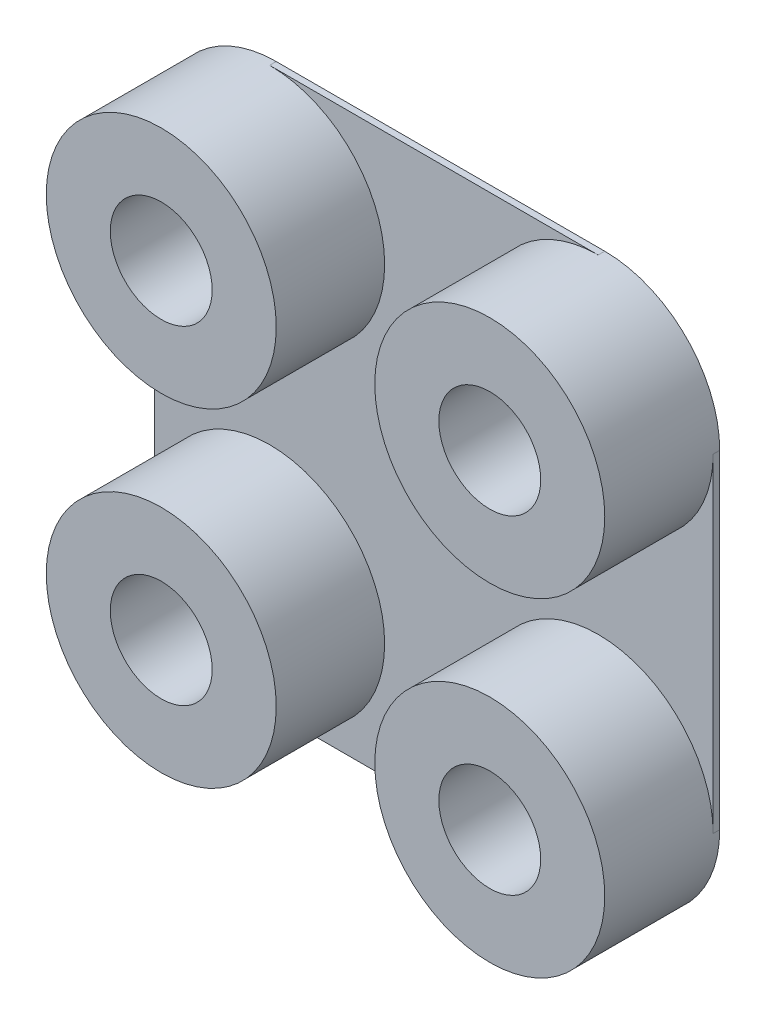
ISO-10303-21;
HEADER;
FILE_DESCRIPTION(('STEP AP214'),'2;1');
FILE_NAME('part.step','',(''),(''),'','','');
FILE_SCHEMA(('AUTOMOTIVE_DESIGN { 1 0 10303 214 1 1 1 1 }'));
ENDSEC;
DATA;
#1=APPLICATION_CONTEXT('core data for automotive mechanical design processes');
#2=APPLICATION_PROTOCOL_DEFINITION('international standard','automotive_design',2000,#1);
#3=PRODUCT_CONTEXT('',#1,'mechanical');
#4=PRODUCT('Part','Part','',(#3));
#5=PRODUCT_RELATED_PRODUCT_CATEGORY('part','',(#4));
#6=PRODUCT_DEFINITION_FORMATION('','',#4);
#7=PRODUCT_DEFINITION_CONTEXT('part definition',#1,'design');
#8=PRODUCT_DEFINITION('design','',#6,#7);
#9=PRODUCT_DEFINITION_SHAPE('','',#8);
#10=(LENGTH_UNIT() NAMED_UNIT(*) SI_UNIT(.MILLI.,.METRE.));
#11=(NAMED_UNIT(*) PLANE_ANGLE_UNIT() SI_UNIT($,.RADIAN.));
#12=(NAMED_UNIT(*) SI_UNIT($,.STERADIAN.) SOLID_ANGLE_UNIT());
#13=UNCERTAINTY_MEASURE_WITH_UNIT(LENGTH_MEASURE(1.E-05),#10,'distance_accuracy_value','');
#14=(GEOMETRIC_REPRESENTATION_CONTEXT(3) GLOBAL_UNCERTAINTY_ASSIGNED_CONTEXT((#13)) GLOBAL_UNIT_ASSIGNED_CONTEXT((#10,
#11,#12)) REPRESENTATION_CONTEXT('',''));
#15=CARTESIAN_POINT('',(0.,0.,0.));
#16=DIRECTION('',(0.,0.,1.));
#17=DIRECTION('',(1.,0.,0.));
#18=AXIS2_PLACEMENT_3D('',#15,#16,#17);
#19=CARTESIAN_POINT('',(0.,0.,3.5));
#20=DIRECTION('',(0.,0.,-1.));
#21=DIRECTION('',(-1.,0.,0.));
#22=AXIS2_PLACEMENT_3D('',#19,#20,#21);
#23=CYLINDRICAL_SURFACE('',#22,1.55);
#24=CARTESIAN_POINT('',(0.,0.,3.5));
#25=DIRECTION('',(0.,0.,1.));
#26=DIRECTION('',(1.,0.,0.));
#27=AXIS2_PLACEMENT_3D('',#24,#25,#26);
#28=CIRCLE('',#27,1.55);
#29=CARTESIAN_POINT('',(1.55,0.,3.5));
#30=VERTEX_POINT('',#29);
#31=EDGE_CURVE('E149',#30,#30,#28,.T.);
#32=ORIENTED_EDGE('',*,*,#31,.T.);
#33=EDGE_LOOP('',(#32));
#34=FACE_BOUND('',#33,.T.);
#35=CARTESIAN_POINT('',(0.,0.,0.2));
#36=DIRECTION('',(0.,0.,-1.));
#37=DIRECTION('',(-1.,0.,0.));
#38=AXIS2_PLACEMENT_3D('',#35,#36,#37);
#39=CIRCLE('',#38,1.55);
#40=CARTESIAN_POINT('',(-1.55,0.,0.2));
#41=VERTEX_POINT('',#40);
#42=EDGE_CURVE('E107',#41,#41,#39,.T.);
#43=ORIENTED_EDGE('',*,*,#42,.T.);
#44=EDGE_LOOP('',(#43));
#45=FACE_BOUND('',#44,.T.);
#46=ADVANCED_FACE('F33',(#34,#45),#23,.F.);
#47=CARTESIAN_POINT('',(0.,0.,3.5));
#48=DIRECTION('',(0.,0.,1.));
#49=DIRECTION('',(1.,0.,0.));
#50=AXIS2_PLACEMENT_3D('',#47,#48,#49);
#51=PLANE('',#50);
#52=CARTESIAN_POINT('',(0.,0.,3.5));
#53=DIRECTION('',(0.,0.,1.));
#54=DIRECTION('',(1.,0.,0.));
#55=AXIS2_PLACEMENT_3D('',#52,#53,#54);
#56=CIRCLE('',#55,3.5);
#57=CARTESIAN_POINT('',(3.5,0.,3.5));
#58=VERTEX_POINT('',#57);
#59=EDGE_CURVE('E153',#58,#58,#56,.T.);
#60=ORIENTED_EDGE('',*,*,#59,.T.);
#61=EDGE_LOOP('',(#60));
#62=FACE_BOUND('',#61,.T.);
#63=ORIENTED_EDGE('',*,*,#31,.F.);
#64=EDGE_LOOP('',(#63));
#65=FACE_BOUND('',#64,.T.);
#66=ADVANCED_FACE('F219',(#62,#65),#51,.T.);
#67=CARTESIAN_POINT('',(0.,0.,0.));
#68=DIRECTION('',(0.,0.,1.));
#69=DIRECTION('',(1.,0.,0.));
#70=AXIS2_PLACEMENT_3D('',#67,#68,#69);
#71=PLANE('',#70);
#72=DIRECTION('',(0.,-1.,0.));
#73=VECTOR('',#72,1.);
#74=CARTESIAN_POINT('',(-3.50000000000004,10.,0.));
#75=LINE('',#74,#73);
#76=CARTESIAN_POINT('',(-3.50000000000004,10.,0.));
#77=VERTEX_POINT('',#76);
#78=CARTESIAN_POINT('',(-3.5,0.,0.));
#79=VERTEX_POINT('',#78);
#80=EDGE_CURVE('E197',#77,#79,#75,.T.);
#81=ORIENTED_EDGE('',*,*,#80,.F.);
#82=CARTESIAN_POINT('',(0.,10.,0.));
#83=DIRECTION('',(0.,0.,1.));
#84=DIRECTION('',(-1.,0.,0.));
#85=AXIS2_PLACEMENT_3D('',#82,#83,#84);
#86=CIRCLE('',#85,3.5);
#87=CARTESIAN_POINT('',(0.,13.5,0.));
#88=VERTEX_POINT('',#87);
#89=EDGE_CURVE('E104',#88,#77,#86,.T.);
#90=ORIENTED_EDGE('',*,*,#89,.F.);
#91=DIRECTION('',(-1.,0.,0.));
#92=VECTOR('',#91,1.);
#93=CARTESIAN_POINT('',(0.,13.5,0.));
#94=LINE('',#93,#92);
#95=CARTESIAN_POINT('',(9.99999999999997,13.5,0.));
#96=VERTEX_POINT('',#95);
#97=EDGE_CURVE('E115',#96,#88,#94,.T.);
#98=ORIENTED_EDGE('',*,*,#97,.F.);
#99=CARTESIAN_POINT('',(9.99999999999997,10.,0.));
#100=DIRECTION('',(0.,0.,1.));
#101=DIRECTION('',(-1.,0.,0.));
#102=AXIS2_PLACEMENT_3D('',#99,#100,#101);
#103=CIRCLE('',#102,3.5);
#104=CARTESIAN_POINT('',(13.5,10.,0.));
#105=VERTEX_POINT('',#104);
#106=EDGE_CURVE('E204',#105,#96,#103,.T.);
#107=ORIENTED_EDGE('',*,*,#106,.F.);
#108=DIRECTION('',(0.,1.,0.));
#109=VECTOR('',#108,1.);
#110=CARTESIAN_POINT('',(13.5,10.,0.));
#111=LINE('',#110,#109);
#112=CARTESIAN_POINT('',(13.5,0.,0.));
#113=VERTEX_POINT('',#112);
#114=EDGE_CURVE('E203',#113,#105,#111,.T.);
#115=ORIENTED_EDGE('',*,*,#114,.F.);
#116=CARTESIAN_POINT('',(10.,0.,0.));
#117=DIRECTION('',(0.,0.,1.));
#118=DIRECTION('',(-1.,0.,0.));
#119=AXIS2_PLACEMENT_3D('',#116,#117,#118);
#120=CIRCLE('',#119,3.5);
#121=CARTESIAN_POINT('',(10.,-3.5,0.));
#122=VERTEX_POINT('',#121);
#123=EDGE_CURVE('E201',#122,#113,#120,.T.);
#124=ORIENTED_EDGE('',*,*,#123,.F.);
#125=DIRECTION('',(1.,0.,0.));
#126=VECTOR('',#125,1.);
#127=CARTESIAN_POINT('',(10.,-3.5,0.));
#128=LINE('',#127,#126);
#129=CARTESIAN_POINT('',(0.,-3.5,0.));
#130=VERTEX_POINT('',#129);
#131=EDGE_CURVE('E199',#130,#122,#128,.T.);
#132=ORIENTED_EDGE('',*,*,#131,.F.);
#133=CARTESIAN_POINT('',(0.,0.,0.));
#134=DIRECTION('',(0.,0.,1.));
#135=DIRECTION('',(1.,0.,0.));
#136=AXIS2_PLACEMENT_3D('',#133,#134,#135);
#137=CIRCLE('',#136,3.5);
#138=EDGE_CURVE('E152',#79,#130,#137,.T.);
#139=ORIENTED_EDGE('',*,*,#138,.F.);
#140=EDGE_LOOP('',(#81,#90,#98,#107,#115,#124,#132,#139));
#141=FACE_BOUND('',#140,.T.);
#142=ADVANCED_FACE('F211',(#141),#71,.F.);
#143=CARTESIAN_POINT('',(0.,0.,3.5));
#144=DIRECTION('',(0.,0.,-1.));
#145=DIRECTION('',(-1.,0.,0.));
#146=AXIS2_PLACEMENT_3D('',#143,#144,#145);
#147=CYLINDRICAL_SURFACE('',#146,3.5);
#148=DIRECTION('',(0.,0.,-1.));
#149=VECTOR('',#148,1.);
#150=CARTESIAN_POINT('',(0.,-3.5,0.2));
#151=LINE('',#150,#149);
#152=CARTESIAN_POINT('',(0.,-3.5,0.2));
#153=VERTEX_POINT('',#152);
#154=EDGE_CURVE('E53',#153,#130,#151,.T.);
#155=ORIENTED_EDGE('',*,*,#154,.F.);
#156=CARTESIAN_POINT('',(0.,0.,0.2));
#157=DIRECTION('',(0.,0.,-1.));
#158=DIRECTION('',(-1.,0.,0.));
#159=AXIS2_PLACEMENT_3D('',#156,#157,#158);
#160=CIRCLE('',#159,3.5);
#161=CARTESIAN_POINT('',(-3.5,0.,0.2));
#162=VERTEX_POINT('',#161);
#163=EDGE_CURVE('E48',#162,#153,#160,.T.);
#164=ORIENTED_EDGE('',*,*,#163,.F.);
#165=DIRECTION('',(0.,0.,-1.));
#166=VECTOR('',#165,1.);
#167=CARTESIAN_POINT('',(-3.5,0.,0.2));
#168=LINE('',#167,#166);
#169=EDGE_CURVE('E108',#162,#79,#168,.T.);
#170=ORIENTED_EDGE('',*,*,#169,.T.);
#171=ORIENTED_EDGE('',*,*,#138,.T.);
#172=EDGE_LOOP('',(#155,#164,#170,#171));
#173=FACE_BOUND('',#172,.T.);
#174=ORIENTED_EDGE('',*,*,#59,.F.);
#175=EDGE_LOOP('',(#174));
#176=FACE_BOUND('',#175,.T.);
#177=ADVANCED_FACE('F35',(#173,#176),#147,.T.);
#178=CARTESIAN_POINT('',(0.,10.,0.2));
#179=DIRECTION('',(0.,0.,-1.));
#180=DIRECTION('',(-1.,0.,0.));
#181=AXIS2_PLACEMENT_3D('',#178,#179,#180);
#182=PLANE('',#181);
#183=ORIENTED_EDGE('',*,*,#42,.F.);
#184=EDGE_LOOP('',(#183));
#185=FACE_BOUND('',#184,.T.);
#186=ADVANCED_FACE('F216',(#185),#182,.F.);
#187=CARTESIAN_POINT('',(0.,10.,0.2));
#188=DIRECTION('',(0.,0.,-1.));
#189=DIRECTION('',(-1.,0.,0.));
#190=AXIS2_PLACEMENT_3D('',#187,#188,#189);
#191=CYLINDRICAL_SURFACE('',#190,3.5);
#192=ORIENTED_EDGE('',*,*,#89,.T.);
#193=DIRECTION('',(0.,0.,-1.));
#194=VECTOR('',#193,1.);
#195=CARTESIAN_POINT('',(-3.50000000000004,10.,0.2));
#196=LINE('',#195,#194);
#197=CARTESIAN_POINT('',(-3.50000000000004,10.,0.2));
#198=VERTEX_POINT('',#197);
#199=EDGE_CURVE('E97',#198,#77,#196,.T.);
#200=ORIENTED_EDGE('',*,*,#199,.F.);
#201=CARTESIAN_POINT('',(0.,10.,0.2));
#202=DIRECTION('',(0.,0.,-1.));
#203=DIRECTION('',(-1.,0.,0.));
#204=AXIS2_PLACEMENT_3D('',#201,#202,#203);
#205=CIRCLE('',#204,3.5);
#206=CARTESIAN_POINT('',(0.,13.5,0.2));
#207=VERTEX_POINT('',#206);
#208=EDGE_CURVE('E11',#198,#207,#205,.F.);
#209=ORIENTED_EDGE('',*,*,#208,.T.);
#210=DIRECTION('',(0.,0.,-1.));
#211=VECTOR('',#210,1.);
#212=CARTESIAN_POINT('',(0.,13.5,0.2));
#213=LINE('',#212,#211);
#214=EDGE_CURVE('E126',#207,#88,#213,.T.);
#215=ORIENTED_EDGE('',*,*,#214,.T.);
#216=EDGE_LOOP('',(#192,#200,#209,#215));
#217=FACE_BOUND('',#216,.T.);
#218=CARTESIAN_POINT('',(0.,10.,3.5));
#219=DIRECTION('',(0.,0.,1.));
#220=DIRECTION('',(1.,0.,0.));
#221=AXIS2_PLACEMENT_3D('',#218,#219,#220);
#222=CIRCLE('',#221,3.5);
#223=CARTESIAN_POINT('',(3.49999999999996,10.,3.5));
#224=VERTEX_POINT('',#223);
#225=EDGE_CURVE('E174',#224,#224,#222,.T.);
#226=ORIENTED_EDGE('',*,*,#225,.F.);
#227=EDGE_LOOP('',(#226));
#228=FACE_BOUND('',#227,.T.);
#229=ADVANCED_FACE('F99',(#217,#228),#191,.T.);
#230=CARTESIAN_POINT('',(-3.50000000000004,10.,0.2));
#231=DIRECTION('',(1.,0.,0.));
#232=DIRECTION('',(0.,1.,0.));
#233=AXIS2_PLACEMENT_3D('',#230,#231,#232);
#234=PLANE('',#233);
#235=ORIENTED_EDGE('',*,*,#80,.T.);
#236=ORIENTED_EDGE('',*,*,#169,.F.);
#237=DIRECTION('',(0.,-1.,0.));
#238=VECTOR('',#237,1.);
#239=CARTESIAN_POINT('',(-3.50000000000004,10.,0.2));
#240=LINE('',#239,#238);
#241=EDGE_CURVE('E111',#198,#162,#240,.T.);
#242=ORIENTED_EDGE('',*,*,#241,.F.);
#243=ORIENTED_EDGE('',*,*,#199,.T.);
#244=EDGE_LOOP('',(#235,#236,#242,#243));
#245=FACE_BOUND('',#244,.T.);
#246=ADVANCED_FACE('F112',(#245),#234,.F.);
#247=CARTESIAN_POINT('',(10.,-3.5,0.2));
#248=DIRECTION('',(0.,1.,0.));
#249=DIRECTION('',(-1.,0.,0.));
#250=AXIS2_PLACEMENT_3D('',#247,#248,#249);
#251=PLANE('',#250);
#252=ORIENTED_EDGE('',*,*,#131,.T.);
#253=DIRECTION('',(0.,0.,-1.));
#254=VECTOR('',#253,1.);
#255=CARTESIAN_POINT('',(10.,-3.5,0.2));
#256=LINE('',#255,#254);
#257=CARTESIAN_POINT('',(10.,-3.5,0.2));
#258=VERTEX_POINT('',#257);
#259=EDGE_CURVE('E143',#258,#122,#256,.T.);
#260=ORIENTED_EDGE('',*,*,#259,.F.);
#261=DIRECTION('',(1.,0.,0.));
#262=VECTOR('',#261,1.);
#263=CARTESIAN_POINT('',(10.,-3.5,0.2));
#264=LINE('',#263,#262);
#265=EDGE_CURVE('E114',#153,#258,#264,.T.);
#266=ORIENTED_EDGE('',*,*,#265,.F.);
#267=ORIENTED_EDGE('',*,*,#154,.T.);
#268=EDGE_LOOP('',(#252,#260,#266,#267));
#269=FACE_BOUND('',#268,.T.);
#270=ADVANCED_FACE('F364',(#269),#251,.F.);
#271=CARTESIAN_POINT('',(10.,0.,0.2));
#272=DIRECTION('',(0.,0.,-1.));
#273=DIRECTION('',(-1.,0.,0.));
#274=AXIS2_PLACEMENT_3D('',#271,#272,#273);
#275=CYLINDRICAL_SURFACE('',#274,3.5);
#276=ORIENTED_EDGE('',*,*,#123,.T.);
#277=DIRECTION('',(0.,0.,-1.));
#278=VECTOR('',#277,1.);
#279=CARTESIAN_POINT('',(13.5,0.,0.2));
#280=LINE('',#279,#278);
#281=CARTESIAN_POINT('',(13.5,0.,0.2));
#282=VERTEX_POINT('',#281);
#283=EDGE_CURVE('E140',#282,#113,#280,.T.);
#284=ORIENTED_EDGE('',*,*,#283,.F.);
#285=CARTESIAN_POINT('',(10.,0.,0.2));
#286=DIRECTION('',(0.,0.,-1.));
#287=DIRECTION('',(-1.,0.,0.));
#288=AXIS2_PLACEMENT_3D('',#285,#286,#287);
#289=CIRCLE('',#288,3.5);
#290=EDGE_CURVE('E156',#282,#258,#289,.F.);
#291=ORIENTED_EDGE('',*,*,#290,.T.);
#292=ORIENTED_EDGE('',*,*,#259,.T.);
#293=EDGE_LOOP('',(#276,#284,#291,#292));
#294=FACE_BOUND('',#293,.T.);
#295=CARTESIAN_POINT('',(10.,0.,3.5));
#296=DIRECTION('',(0.,0.,1.));
#297=DIRECTION('',(1.,0.,0.));
#298=AXIS2_PLACEMENT_3D('',#295,#296,#297);
#299=CIRCLE('',#298,3.5);
#300=CARTESIAN_POINT('',(13.5,0.,3.5));
#301=VERTEX_POINT('',#300);
#302=EDGE_CURVE('E163',#301,#301,#299,.T.);
#303=ORIENTED_EDGE('',*,*,#302,.F.);
#304=EDGE_LOOP('',(#303));
#305=FACE_BOUND('',#304,.T.);
#306=ADVANCED_FACE('F373',(#294,#305),#275,.T.);
#307=CARTESIAN_POINT('',(13.5,10.,0.2));
#308=DIRECTION('',(-1.,0.,0.));
#309=DIRECTION('',(0.,-1.,0.));
#310=AXIS2_PLACEMENT_3D('',#307,#308,#309);
#311=PLANE('',#310);
#312=ORIENTED_EDGE('',*,*,#114,.T.);
#313=DIRECTION('',(0.,0.,-1.));
#314=VECTOR('',#313,1.);
#315=CARTESIAN_POINT('',(13.5,10.,0.2));
#316=LINE('',#315,#314);
#317=CARTESIAN_POINT('',(13.5,10.,0.2));
#318=VERTEX_POINT('',#317);
#319=EDGE_CURVE('E133',#318,#105,#316,.T.);
#320=ORIENTED_EDGE('',*,*,#319,.F.);
#321=DIRECTION('',(0.,1.,0.));
#322=VECTOR('',#321,1.);
#323=CARTESIAN_POINT('',(13.5,10.,0.2));
#324=LINE('',#323,#322);
#325=EDGE_CURVE('E127',#282,#318,#324,.T.);
#326=ORIENTED_EDGE('',*,*,#325,.F.);
#327=ORIENTED_EDGE('',*,*,#283,.T.);
#328=EDGE_LOOP('',(#312,#320,#326,#327));
#329=FACE_BOUND('',#328,.T.);
#330=ADVANCED_FACE('F383',(#329),#311,.F.);
#331=CARTESIAN_POINT('',(9.99999999999997,10.,0.2));
#332=DIRECTION('',(0.,0.,-1.));
#333=DIRECTION('',(-1.,0.,0.));
#334=AXIS2_PLACEMENT_3D('',#331,#332,#333);
#335=CYLINDRICAL_SURFACE('',#334,3.5);
#336=ORIENTED_EDGE('',*,*,#106,.T.);
#337=DIRECTION('',(0.,0.,-1.));
#338=VECTOR('',#337,1.);
#339=CARTESIAN_POINT('',(9.99999999999997,13.5,0.2));
#340=LINE('',#339,#338);
#341=CARTESIAN_POINT('',(9.99999999999997,13.5,0.2));
#342=VERTEX_POINT('',#341);
#343=EDGE_CURVE('E131',#342,#96,#340,.T.);
#344=ORIENTED_EDGE('',*,*,#343,.F.);
#345=CARTESIAN_POINT('',(9.99999999999997,10.,0.2));
#346=DIRECTION('',(0.,0.,-1.));
#347=DIRECTION('',(-1.,0.,0.));
#348=AXIS2_PLACEMENT_3D('',#345,#346,#347);
#349=CIRCLE('',#348,3.5);
#350=EDGE_CURVE('E41',#342,#318,#349,.F.);
#351=ORIENTED_EDGE('',*,*,#350,.T.);
#352=ORIENTED_EDGE('',*,*,#319,.T.);
#353=EDGE_LOOP('',(#336,#344,#351,#352));
#354=FACE_BOUND('',#353,.T.);
#355=CARTESIAN_POINT('',(9.99999999999997,10.,3.5));
#356=DIRECTION('',(0.,0.,1.));
#357=DIRECTION('',(1.,0.,0.));
#358=AXIS2_PLACEMENT_3D('',#355,#356,#357);
#359=CIRCLE('',#358,3.5);
#360=CARTESIAN_POINT('',(13.5,10.,3.5));
#361=VERTEX_POINT('',#360);
#362=EDGE_CURVE('E170',#361,#361,#359,.T.);
#363=ORIENTED_EDGE('',*,*,#362,.F.);
#364=EDGE_LOOP('',(#363));
#365=FACE_BOUND('',#364,.T.);
#366=ADVANCED_FACE('F207',(#354,#365),#335,.T.);
#367=CARTESIAN_POINT('',(0.,13.5,0.2));
#368=DIRECTION('',(0.,-1.,0.));
#369=DIRECTION('',(0.,0.,-1.));
#370=AXIS2_PLACEMENT_3D('',#367,#368,#369);
#371=PLANE('',#370);
#372=ORIENTED_EDGE('',*,*,#97,.T.);
#373=ORIENTED_EDGE('',*,*,#214,.F.);
#374=DIRECTION('',(-1.,0.,0.));
#375=VECTOR('',#374,1.);
#376=CARTESIAN_POINT('',(0.,13.5,0.2));
#377=LINE('',#376,#375);
#378=EDGE_CURVE('E119',#342,#207,#377,.T.);
#379=ORIENTED_EDGE('',*,*,#378,.F.);
#380=ORIENTED_EDGE('',*,*,#343,.T.);
#381=EDGE_LOOP('',(#372,#373,#379,#380));
#382=FACE_BOUND('',#381,.T.);
#383=ADVANCED_FACE('F129',(#382),#371,.F.);
#384=ORIENTED_EDGE('',*,*,#208,.F.);
#385=ORIENTED_EDGE('',*,*,#241,.T.);
#386=ORIENTED_EDGE('',*,*,#163,.T.);
#387=ORIENTED_EDGE('',*,*,#265,.T.);
#388=ORIENTED_EDGE('',*,*,#290,.F.);
#389=ORIENTED_EDGE('',*,*,#325,.T.);
#390=ORIENTED_EDGE('',*,*,#350,.F.);
#391=ORIENTED_EDGE('',*,*,#378,.T.);
#392=EDGE_LOOP('',(#384,#385,#386,#387,#388,#389,#390,#391));
#393=FACE_BOUND('',#392,.T.);
#394=ADVANCED_FACE('F117',(#393),#182,.F.);
#395=CARTESIAN_POINT('',(10.,0.,3.5));
#396=DIRECTION('',(0.,0.,-1.));
#397=DIRECTION('',(-1.,0.,0.));
#398=AXIS2_PLACEMENT_3D('',#395,#396,#397);
#399=CYLINDRICAL_SURFACE('',#398,1.55);
#400=CARTESIAN_POINT('',(10.,0.,3.5));
#401=DIRECTION('',(0.,0.,1.));
#402=DIRECTION('',(1.,0.,0.));
#403=AXIS2_PLACEMENT_3D('',#400,#401,#402);
#404=CIRCLE('',#403,1.55);
#405=CARTESIAN_POINT('',(11.55,0.,3.5));
#406=VERTEX_POINT('',#405);
#407=EDGE_CURVE('E169',#406,#406,#404,.T.);
#408=ORIENTED_EDGE('',*,*,#407,.T.);
#409=EDGE_LOOP('',(#408));
#410=FACE_BOUND('',#409,.T.);
#411=CARTESIAN_POINT('',(10.,0.,0.2));
#412=DIRECTION('',(0.,0.,-1.));
#413=DIRECTION('',(-1.,0.,0.));
#414=AXIS2_PLACEMENT_3D('',#411,#412,#413);
#415=CIRCLE('',#414,1.55);
#416=CARTESIAN_POINT('',(8.45,0.,0.2));
#417=VERTEX_POINT('',#416);
#418=EDGE_CURVE('E160',#417,#417,#415,.F.);
#419=ORIENTED_EDGE('',*,*,#418,.F.);
#420=EDGE_LOOP('',(#419));
#421=FACE_BOUND('',#420,.T.);
#422=ADVANCED_FACE('F240',(#410,#421),#399,.F.);
#423=CARTESIAN_POINT('',(10.,0.,3.5));
#424=DIRECTION('',(0.,0.,1.));
#425=DIRECTION('',(1.,0.,0.));
#426=AXIS2_PLACEMENT_3D('',#423,#424,#425);
#427=PLANE('',#426);
#428=ORIENTED_EDGE('',*,*,#302,.T.);
#429=EDGE_LOOP('',(#428));
#430=FACE_BOUND('',#429,.T.);
#431=ORIENTED_EDGE('',*,*,#407,.F.);
#432=EDGE_LOOP('',(#431));
#433=FACE_BOUND('',#432,.T.);
#434=ADVANCED_FACE('F244',(#430,#433),#427,.T.);
#435=ORIENTED_EDGE('',*,*,#418,.T.);
#436=EDGE_LOOP('',(#435));
#437=FACE_BOUND('',#436,.T.);
#438=ADVANCED_FACE('F232',(#437),#182,.F.);
#439=CARTESIAN_POINT('',(9.99999999999997,10.,3.5));
#440=DIRECTION('',(0.,0.,-1.));
#441=DIRECTION('',(-1.,0.,0.));
#442=AXIS2_PLACEMENT_3D('',#439,#440,#441);
#443=CYLINDRICAL_SURFACE('',#442,1.55);
#444=CARTESIAN_POINT('',(9.99999999999997,10.,3.5));
#445=DIRECTION('',(0.,0.,1.));
#446=DIRECTION('',(1.,0.,0.));
#447=AXIS2_PLACEMENT_3D('',#444,#445,#446);
#448=CIRCLE('',#447,1.55);
#449=CARTESIAN_POINT('',(11.55,10.,3.5));
#450=VERTEX_POINT('',#449);
#451=EDGE_CURVE('E173',#450,#450,#448,.T.);
#452=ORIENTED_EDGE('',*,*,#451,.T.);
#453=EDGE_LOOP('',(#452));
#454=FACE_BOUND('',#453,.T.);
#455=CARTESIAN_POINT('',(9.99999999999997,10.,0.2));
#456=DIRECTION('',(0.,0.,-1.));
#457=DIRECTION('',(-1.,0.,0.));
#458=AXIS2_PLACEMENT_3D('',#455,#456,#457);
#459=CIRCLE('',#458,1.55);
#460=CARTESIAN_POINT('',(8.44999999999997,10.,0.2));
#461=VERTEX_POINT('',#460);
#462=EDGE_CURVE('E166',#461,#461,#459,.F.);
#463=ORIENTED_EDGE('',*,*,#462,.F.);
#464=EDGE_LOOP('',(#463));
#465=FACE_BOUND('',#464,.T.);
#466=ADVANCED_FACE('F243',(#454,#465),#443,.F.);
#467=CARTESIAN_POINT('',(9.99999999999997,10.,3.5));
#468=DIRECTION('',(0.,0.,1.));
#469=DIRECTION('',(1.,0.,0.));
#470=AXIS2_PLACEMENT_3D('',#467,#468,#469);
#471=PLANE('',#470);
#472=ORIENTED_EDGE('',*,*,#362,.T.);
#473=EDGE_LOOP('',(#472));
#474=FACE_BOUND('',#473,.T.);
#475=ORIENTED_EDGE('',*,*,#451,.F.);
#476=EDGE_LOOP('',(#475));
#477=FACE_BOUND('',#476,.T.);
#478=ADVANCED_FACE('F251',(#474,#477),#471,.T.);
#479=ORIENTED_EDGE('',*,*,#462,.T.);
#480=EDGE_LOOP('',(#479));
#481=FACE_BOUND('',#480,.T.);
#482=ADVANCED_FACE('F246',(#481),#182,.F.);
#483=CARTESIAN_POINT('',(0.,10.,3.5));
#484=DIRECTION('',(0.,0.,-1.));
#485=DIRECTION('',(-1.,0.,0.));
#486=AXIS2_PLACEMENT_3D('',#483,#484,#485);
#487=CYLINDRICAL_SURFACE('',#486,1.55);
#488=CARTESIAN_POINT('',(0.,10.,3.5));
#489=DIRECTION('',(0.,0.,1.));
#490=DIRECTION('',(1.,0.,0.));
#491=AXIS2_PLACEMENT_3D('',#488,#489,#490);
#492=CIRCLE('',#491,1.55);
#493=CARTESIAN_POINT('',(1.54999999999997,10.,3.5));
#494=VERTEX_POINT('',#493);
#495=EDGE_CURVE('E180',#494,#494,#492,.T.);
#496=ORIENTED_EDGE('',*,*,#495,.T.);
#497=EDGE_LOOP('',(#496));
#498=FACE_BOUND('',#497,.T.);
#499=CARTESIAN_POINT('',(0.,10.,0.2));
#500=DIRECTION('',(0.,0.,-1.));
#501=DIRECTION('',(-1.,0.,0.));
#502=AXIS2_PLACEMENT_3D('',#499,#500,#501);
#503=CIRCLE('',#502,1.55);
#504=CARTESIAN_POINT('',(-1.55000000000004,10.,0.2));
#505=VERTEX_POINT('',#504);
#506=EDGE_CURVE('E171',#505,#505,#503,.F.);
#507=ORIENTED_EDGE('',*,*,#506,.F.);
#508=EDGE_LOOP('',(#507));
#509=FACE_BOUND('',#508,.T.);
#510=ADVANCED_FACE('F256',(#498,#509),#487,.F.);
#511=CARTESIAN_POINT('',(0.,10.,3.5));
#512=DIRECTION('',(0.,0.,1.));
#513=DIRECTION('',(1.,0.,0.));
#514=AXIS2_PLACEMENT_3D('',#511,#512,#513);
#515=PLANE('',#514);
#516=ORIENTED_EDGE('',*,*,#225,.T.);
#517=EDGE_LOOP('',(#516));
#518=FACE_BOUND('',#517,.T.);
#519=ORIENTED_EDGE('',*,*,#495,.F.);
#520=EDGE_LOOP('',(#519));
#521=FACE_BOUND('',#520,.T.);
#522=ADVANCED_FACE('F262',(#518,#521),#515,.T.);
#523=ORIENTED_EDGE('',*,*,#506,.T.);
#524=EDGE_LOOP('',(#523));
#525=FACE_BOUND('',#524,.T.);
#526=ADVANCED_FACE('F241',(#525),#182,.F.);
#527=CLOSED_SHELL('',(#46,#66,#142,#177,#186,#229,#246,#270,#306,#330,#366,#383,#394,#422,#434,
#438,#466,#478,#482,#510,#522,#526));
#528=MANIFOLD_SOLID_BREP('B2',#527);
#529=ADVANCED_BREP_SHAPE_REPRESENTATION('',(#18,#528),#14);
#530=SHAPE_DEFINITION_REPRESENTATION(#9,#529);
ENDSEC;
END-ISO-10303-21;
